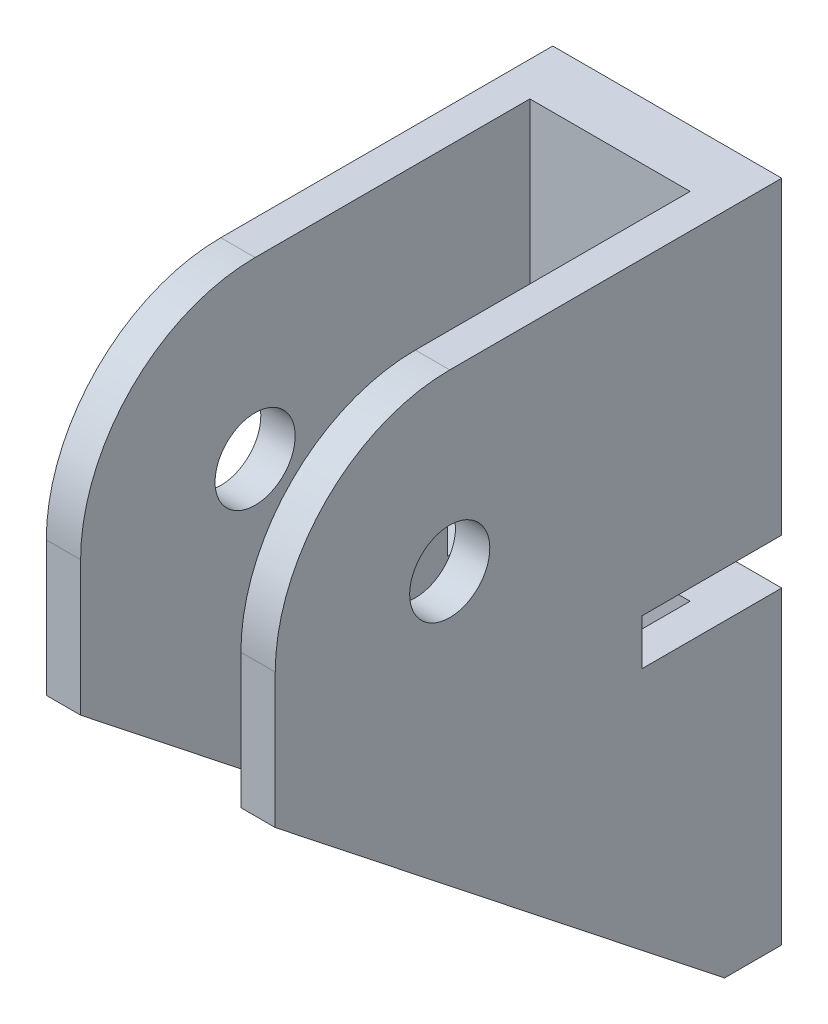
ISO-10303-21;
HEADER;
FILE_DESCRIPTION(('STEP AP214'),'2;1');
FILE_NAME('part.step','',(''),(''),'','','');
FILE_SCHEMA(('AUTOMOTIVE_DESIGN { 1 0 10303 214 1 1 1 1 }'));
ENDSEC;
DATA;
#1=APPLICATION_CONTEXT('core data for automotive mechanical design processes');
#2=APPLICATION_PROTOCOL_DEFINITION('international standard','automotive_design',2000,#1);
#3=PRODUCT_CONTEXT('',#1,'mechanical');
#4=PRODUCT('Part','Part','',(#3));
#5=PRODUCT_RELATED_PRODUCT_CATEGORY('part','',(#4));
#6=PRODUCT_DEFINITION_FORMATION('','',#4);
#7=PRODUCT_DEFINITION_CONTEXT('part definition',#1,'design');
#8=PRODUCT_DEFINITION('design','',#6,#7);
#9=PRODUCT_DEFINITION_SHAPE('','',#8);
#10=(LENGTH_UNIT() NAMED_UNIT(*) SI_UNIT(.MILLI.,.METRE.));
#11=(NAMED_UNIT(*) PLANE_ANGLE_UNIT() SI_UNIT($,.RADIAN.));
#12=(NAMED_UNIT(*) SI_UNIT($,.STERADIAN.) SOLID_ANGLE_UNIT());
#13=UNCERTAINTY_MEASURE_WITH_UNIT(LENGTH_MEASURE(1.E-05),#10,'distance_accuracy_value','');
#14=(GEOMETRIC_REPRESENTATION_CONTEXT(3) GLOBAL_UNCERTAINTY_ASSIGNED_CONTEXT((#13)) GLOBAL_UNIT_ASSIGNED_CONTEXT((#10,
#11,#12)) REPRESENTATION_CONTEXT('',''));
#15=CARTESIAN_POINT('',(0.,0.,0.));
#16=DIRECTION('',(0.,0.,1.));
#17=DIRECTION('',(1.,0.,0.));
#18=AXIS2_PLACEMENT_3D('',#15,#16,#17);
#19=CARTESIAN_POINT('',(0.,0.,2.5));
#20=DIRECTION('',(0.,0.,1.));
#21=DIRECTION('',(1.,0.,0.));
#22=AXIS2_PLACEMENT_3D('',#19,#20,#21);
#23=PLANE('',#22);
#24=CARTESIAN_POINT('',(8.63063628005088,59.9219213633693,2.5));
#25=DIRECTION('',(0.,0.,1.));
#26=DIRECTION('',(1.,0.,0.));
#27=AXIS2_PLACEMENT_3D('',#24,#25,#26);
#28=CIRCLE('',#27,1.75);
#29=CARTESIAN_POINT('',(10.3806362800509,59.9219213633693,2.5));
#30=VERTEX_POINT('',#29);
#31=EDGE_CURVE('E311',#30,#30,#28,.T.);
#32=ORIENTED_EDGE('',*,*,#31,.F.);
#33=EDGE_LOOP('',(#32));
#34=FACE_BOUND('',#33,.T.);
#35=DIRECTION('',(1.,0.,0.));
#36=VECTOR('',#35,1.);
#37=CARTESIAN_POINT('',(0.,52.4219213633683,2.5));
#38=LINE('',#37,#36);
#39=CARTESIAN_POINT('',(5.13063628005088,52.4219213633683,2.5));
#40=VERTEX_POINT('',#39);
#41=CARTESIAN_POINT('',(12.1306362800509,52.4219213633683,2.5));
#42=VERTEX_POINT('',#41);
#43=EDGE_CURVE('E317',#40,#42,#38,.T.);
#44=ORIENTED_EDGE('',*,*,#43,.T.);
#45=DIRECTION('',(0.,1.,0.));
#46=VECTOR('',#45,1.);
#47=CARTESIAN_POINT('',(12.1306362800509,0.,2.5));
#48=LINE('',#47,#46);
#49=CARTESIAN_POINT('',(12.1306362800509,65.9219213633693,2.5));
#50=VERTEX_POINT('',#49);
#51=EDGE_CURVE('E51',#42,#50,#48,.T.);
#52=ORIENTED_EDGE('',*,*,#51,.T.);
#53=DIRECTION('',(1.,0.,0.));
#54=VECTOR('',#53,1.);
#55=CARTESIAN_POINT('',(0.,65.9219213633693,2.5));
#56=LINE('',#55,#54);
#57=CARTESIAN_POINT('',(5.13063628005088,65.9219213633693,2.5));
#58=VERTEX_POINT('',#57);
#59=EDGE_CURVE('E314',#58,#50,#56,.T.);
#60=ORIENTED_EDGE('',*,*,#59,.F.);
#61=DIRECTION('',(0.,1.,0.));
#62=VECTOR('',#61,1.);
#63=CARTESIAN_POINT('',(5.13063628005088,0.,2.5));
#64=LINE('',#63,#62);
#65=EDGE_CURVE('E274',#40,#58,#64,.T.);
#66=ORIENTED_EDGE('',*,*,#65,.F.);
#67=EDGE_LOOP('',(#44,#52,#60,#66));
#68=FACE_BOUND('',#67,.T.);
#69=ADVANCED_FACE('F35',(#34,#68),#23,.T.);
#70=CARTESIAN_POINT('',(0.,0.,2.5));
#71=DIRECTION('',(0.,0.,1.));
#72=DIRECTION('',(1.,0.,0.));
#73=AXIS2_PLACEMENT_3D('',#70,#71,#72);
#74=PLANE('',#73);
#75=CARTESIAN_POINT('',(8.63063628005088,74.4219213633691,2.5));
#76=DIRECTION('',(0.,0.,1.));
#77=DIRECTION('',(1.,0.,0.));
#78=AXIS2_PLACEMENT_3D('',#75,#76,#77);
#79=CIRCLE('',#78,1.75);
#80=CARTESIAN_POINT('',(10.3806362800509,74.4219213633691,2.5));
#81=VERTEX_POINT('',#80);
#82=EDGE_CURVE('E237',#81,#81,#79,.T.);
#83=ORIENTED_EDGE('',*,*,#82,.F.);
#84=EDGE_LOOP('',(#83));
#85=FACE_BOUND('',#84,.T.);
#86=DIRECTION('',(1.,0.,0.));
#87=VECTOR('',#86,1.);
#88=CARTESIAN_POINT('',(0.,67.9219213633687,2.5));
#89=LINE('',#88,#87);
#90=CARTESIAN_POINT('',(5.13063628005088,67.9219213633687,2.5));
#91=VERTEX_POINT('',#90);
#92=CARTESIAN_POINT('',(12.1306362800509,67.9219213633687,2.5));
#93=VERTEX_POINT('',#92);
#94=EDGE_CURVE('E233',#91,#93,#89,.T.);
#95=ORIENTED_EDGE('',*,*,#94,.T.);
#96=DIRECTION('',(0.,1.,0.));
#97=VECTOR('',#96,1.);
#98=CARTESIAN_POINT('',(12.1306362800509,0.,2.5));
#99=LINE('',#98,#97);
#100=CARTESIAN_POINT('',(12.1306362800509,81.421921363369,2.5));
#101=VERTEX_POINT('',#100);
#102=EDGE_CURVE('E211',#93,#101,#99,.T.);
#103=ORIENTED_EDGE('',*,*,#102,.T.);
#104=DIRECTION('',(1.,0.,0.));
#105=VECTOR('',#104,1.);
#106=CARTESIAN_POINT('',(0.,81.421921363369,2.5));
#107=LINE('',#106,#105);
#108=CARTESIAN_POINT('',(5.13063628005088,81.421921363369,2.5));
#109=VERTEX_POINT('',#108);
#110=EDGE_CURVE('E230',#109,#101,#107,.T.);
#111=ORIENTED_EDGE('',*,*,#110,.F.);
#112=DIRECTION('',(0.,1.,0.));
#113=VECTOR('',#112,1.);
#114=CARTESIAN_POINT('',(5.13063628005088,0.,2.5));
#115=LINE('',#114,#113);
#116=EDGE_CURVE('E264',#91,#109,#115,.T.);
#117=ORIENTED_EDGE('',*,*,#116,.F.);
#118=EDGE_LOOP('',(#95,#103,#111,#117));
#119=FACE_BOUND('',#118,.T.);
#120=ADVANCED_FACE('F398',(#85,#119),#74,.T.);
#121=CARTESIAN_POINT('',(13.6306362800509,0.,2.5));
#122=DIRECTION('',(1.,0.,0.));
#123=DIRECTION('',(0.,0.,-1.));
#124=AXIS2_PLACEMENT_3D('',#121,#122,#123);
#125=PLANE('',#124);
#126=CARTESIAN_POINT('',(13.6306362800509,73.801921363369,14.5));
#127=DIRECTION('',(1.,0.,0.));
#128=DIRECTION('',(0.,0.,-1.));
#129=AXIS2_PLACEMENT_3D('',#126,#127,#128);
#130=CIRCLE('',#129,1.7499965);
#131=CARTESIAN_POINT('',(13.6306362800509,72.051924863369,14.5));
#132=VERTEX_POINT('',#131);
#133=EDGE_CURVE('E198',#132,#132,#130,.T.);
#134=ORIENTED_EDGE('',*,*,#133,.F.);
#135=EDGE_LOOP('',(#134));
#136=FACE_BOUND('',#135,.T.);
#137=DIRECTION('',(0.,-1.,0.));
#138=VECTOR('',#137,1.);
#139=CARTESIAN_POINT('',(13.6306362800509,0.,0.));
#140=LINE('',#139,#138);
#141=CARTESIAN_POINT('',(13.6306362800509,65.9219213633693,0.));
#142=VERTEX_POINT('',#141);
#143=CARTESIAN_POINT('',(13.6306362800509,52.4219213633683,0.));
#144=VERTEX_POINT('',#143);
#145=EDGE_CURVE('E324',#142,#144,#140,.T.);
#146=ORIENTED_EDGE('',*,*,#145,.F.);
#147=DIRECTION('',(0.,0.,-1.));
#148=VECTOR('',#147,1.);
#149=CARTESIAN_POINT('',(13.6306362800509,65.9219213633693,2.5));
#150=LINE('',#149,#148);
#151=CARTESIAN_POINT('',(13.6306362800509,65.9219213633693,6.10015991446744));
#152=VERTEX_POINT('',#151);
#153=EDGE_CURVE('E11',#152,#142,#150,.T.);
#154=ORIENTED_EDGE('',*,*,#153,.F.);
#155=DIRECTION('',(0.,1.,0.));
#156=VECTOR('',#155,1.);
#157=CARTESIAN_POINT('',(13.6306362800509,0.,6.10015991446744));
#158=LINE('',#157,#156);
#159=CARTESIAN_POINT('',(13.6306362800509,67.9219213633687,6.10015991446744));
#160=VERTEX_POINT('',#159);
#161=EDGE_CURVE('E192',#152,#160,#158,.T.);
#162=ORIENTED_EDGE('',*,*,#161,.T.);
#163=DIRECTION('',(0.,0.,-1.));
#164=VECTOR('',#163,1.);
#165=CARTESIAN_POINT('',(13.6306362800509,67.9219213633687,2.5));
#166=LINE('',#165,#164);
#167=CARTESIAN_POINT('',(13.6306362800509,67.9219213633687,0.));
#168=VERTEX_POINT('',#167);
#169=EDGE_CURVE('E240',#160,#168,#166,.T.);
#170=ORIENTED_EDGE('',*,*,#169,.T.);
#171=DIRECTION('',(0.,-1.,0.));
#172=VECTOR('',#171,1.);
#173=CARTESIAN_POINT('',(13.6306362800508,0.,0.));
#174=LINE('',#173,#172);
#175=CARTESIAN_POINT('',(13.6306362800509,81.421921363369,0.));
#176=VERTEX_POINT('',#175);
#177=EDGE_CURVE('E221',#176,#168,#174,.T.);
#178=ORIENTED_EDGE('',*,*,#177,.F.);
#179=DIRECTION('',(0.,0.,-1.));
#180=VECTOR('',#179,1.);
#181=CARTESIAN_POINT('',(13.6306362800509,81.421921363369,2.5));
#182=LINE('',#181,#180);
#183=CARTESIAN_POINT('',(13.6306362800509,81.421921363369,14.5));
#184=VERTEX_POINT('',#183);
#185=EDGE_CURVE('E255',#184,#176,#182,.T.);
#186=ORIENTED_EDGE('',*,*,#185,.F.);
#187=CARTESIAN_POINT('',(13.6306362800509,73.801921363369,14.5));
#188=DIRECTION('',(-1.,0.,0.));
#189=DIRECTION('',(0.,0.,1.));
#190=AXIS2_PLACEMENT_3D('',#187,#188,#189);
#191=CIRCLE('',#190,7.62);
#192=CARTESIAN_POINT('',(13.6306362800509,73.801921363369,22.12));
#193=VERTEX_POINT('',#192);
#194=EDGE_CURVE('E215',#184,#193,#191,.F.);
#195=ORIENTED_EDGE('',*,*,#194,.T.);
#196=DIRECTION('',(0.,-1.,0.));
#197=VECTOR('',#196,1.);
#198=CARTESIAN_POINT('',(13.6306362800509,0.,22.12));
#199=LINE('',#198,#197);
#200=CARTESIAN_POINT('',(13.6306362800509,67.9219213633687,22.12));
#201=VERTEX_POINT('',#200);
#202=EDGE_CURVE('E172',#193,#201,#199,.T.);
#203=ORIENTED_EDGE('',*,*,#202,.T.);
#204=DIRECTION('',(0.,0.619903600087596,0.784677976368929));
#205=VECTOR('',#204,1.);
#206=CARTESIAN_POINT('',(13.6306362800509,31.0611388490823,-24.5386163180828));
#207=LINE('',#206,#205);
#208=CARTESIAN_POINT('',(13.6306362800509,52.4219213633684,2.5));
#209=VERTEX_POINT('',#208);
#210=EDGE_CURVE('E195',#209,#201,#207,.T.);
#211=ORIENTED_EDGE('',*,*,#210,.F.);
#212=DIRECTION('',(0.,0.,-1.));
#213=VECTOR('',#212,1.);
#214=CARTESIAN_POINT('',(13.6306362800509,52.4219213633683,2.5));
#215=LINE('',#214,#213);
#216=EDGE_CURVE('E321',#209,#144,#215,.T.);
#217=ORIENTED_EDGE('',*,*,#216,.T.);
#218=EDGE_LOOP('',(#146,#154,#162,#170,#178,#186,#195,#203,#211,#217));
#219=FACE_BOUND('',#218,.T.);
#220=ADVANCED_FACE('F352',(#136,#219),#125,.T.);
#221=CARTESIAN_POINT('',(0.,65.9219213633693,2.5));
#222=DIRECTION('',(0.,1.,0.));
#223=DIRECTION('',(0.,0.,1.));
#224=AXIS2_PLACEMENT_3D('',#221,#222,#223);
#225=PLANE('',#224);
#226=DIRECTION('',(1.,0.,0.));
#227=VECTOR('',#226,1.);
#228=CARTESIAN_POINT('',(0.,65.9219213633693,0.));
#229=LINE('',#228,#227);
#230=CARTESIAN_POINT('',(3.63063628005088,65.9219213633693,0.));
#231=VERTEX_POINT('',#230);
#232=EDGE_CURVE('E327',#231,#142,#229,.T.);
#233=ORIENTED_EDGE('',*,*,#232,.F.);
#234=DIRECTION('',(0.,0.,-1.));
#235=VECTOR('',#234,1.);
#236=CARTESIAN_POINT('',(3.63063628005088,65.9219213633693,2.5));
#237=LINE('',#236,#235);
#238=CARTESIAN_POINT('',(3.63063628005088,65.9219213633693,6.10015991446744));
#239=VERTEX_POINT('',#238);
#240=EDGE_CURVE('E44',#239,#231,#237,.T.);
#241=ORIENTED_EDGE('',*,*,#240,.F.);
#242=DIRECTION('',(-1.,0.,0.));
#243=VECTOR('',#242,1.);
#244=CARTESIAN_POINT('',(5.13063628005088,65.9219213633693,6.10015991446744));
#245=LINE('',#244,#243);
#246=CARTESIAN_POINT('',(5.13063628005088,65.9219213633693,6.10015991446744));
#247=VERTEX_POINT('',#246);
#248=EDGE_CURVE('E304',#247,#239,#245,.T.);
#249=ORIENTED_EDGE('',*,*,#248,.F.);
#250=DIRECTION('',(0.,0.,1.));
#251=VECTOR('',#250,1.);
#252=CARTESIAN_POINT('',(5.13063628005088,65.9219213633693,0.));
#253=LINE('',#252,#251);
#254=EDGE_CURVE('E272',#58,#247,#253,.T.);
#255=ORIENTED_EDGE('',*,*,#254,.F.);
#256=ORIENTED_EDGE('',*,*,#59,.T.);
#257=DIRECTION('',(0.,0.,1.));
#258=VECTOR('',#257,1.);
#259=CARTESIAN_POINT('',(12.1306362800509,65.9219213633693,0.));
#260=LINE('',#259,#258);
#261=CARTESIAN_POINT('',(12.1306362800509,65.9219213633693,6.10015991446744));
#262=VERTEX_POINT('',#261);
#263=EDGE_CURVE('E203',#50,#262,#260,.T.);
#264=ORIENTED_EDGE('',*,*,#263,.T.);
#265=DIRECTION('',(1.,0.,0.));
#266=VECTOR('',#265,1.);
#267=CARTESIAN_POINT('',(12.1306362800509,65.9219213633693,6.10015991446744));
#268=LINE('',#267,#266);
#269=EDGE_CURVE('E225',#262,#152,#268,.T.);
#270=ORIENTED_EDGE('',*,*,#269,.T.);
#271=ORIENTED_EDGE('',*,*,#153,.T.);
#272=EDGE_LOOP('',(#233,#241,#249,#255,#256,#264,#270,#271));
#273=FACE_BOUND('',#272,.T.);
#274=ADVANCED_FACE('F348',(#273),#225,.T.);
#275=CARTESIAN_POINT('',(3.63063628005091,0.,2.5));
#276=DIRECTION('',(1.,0.,0.));
#277=DIRECTION('',(0.,1.,0.));
#278=AXIS2_PLACEMENT_3D('',#275,#276,#277);
#279=PLANE('',#278);
#280=CARTESIAN_POINT('',(3.63063628005087,73.801921363369,14.5));
#281=DIRECTION('',(-1.,0.,0.));
#282=DIRECTION('',(0.,-1.,0.));
#283=AXIS2_PLACEMENT_3D('',#280,#281,#282);
#284=CIRCLE('',#283,1.7499965);
#285=CARTESIAN_POINT('',(3.63063628005088,72.051924863369,14.5));
#286=VERTEX_POINT('',#285);
#287=EDGE_CURVE('E649',#286,#286,#284,.T.);
#288=ORIENTED_EDGE('',*,*,#287,.F.);
#289=EDGE_LOOP('',(#288));
#290=FACE_BOUND('',#289,.T.);
#291=DIRECTION('',(0.,-1.,0.));
#292=VECTOR('',#291,1.);
#293=CARTESIAN_POINT('',(3.63063628005091,0.,0.));
#294=LINE('',#293,#292);
#295=CARTESIAN_POINT('',(3.63063628005088,52.4219213633683,0.));
#296=VERTEX_POINT('',#295);
#297=EDGE_CURVE('E330',#231,#296,#294,.T.);
#298=ORIENTED_EDGE('',*,*,#297,.T.);
#299=DIRECTION('',(0.,0.,-1.));
#300=VECTOR('',#299,1.);
#301=CARTESIAN_POINT('',(3.63063628005088,52.4219213633683,2.5));
#302=LINE('',#301,#300);
#303=CARTESIAN_POINT('',(3.63063628005088,52.4219213633684,2.5));
#304=VERTEX_POINT('',#303);
#305=EDGE_CURVE('E336',#304,#296,#302,.T.);
#306=ORIENTED_EDGE('',*,*,#305,.F.);
#307=DIRECTION('',(0.,0.619903600087596,0.784677976368929));
#308=VECTOR('',#307,1.);
#309=CARTESIAN_POINT('',(3.63063628005088,31.0611388490823,-24.5386163180828));
#310=LINE('',#309,#308);
#311=CARTESIAN_POINT('',(3.63063628005088,67.9219213633687,22.12));
#312=VERTEX_POINT('',#311);
#313=EDGE_CURVE('E293',#304,#312,#310,.T.);
#314=ORIENTED_EDGE('',*,*,#313,.T.);
#315=DIRECTION('',(0.,-1.,0.));
#316=VECTOR('',#315,1.);
#317=CARTESIAN_POINT('',(3.63063628005088,0.,22.12));
#318=LINE('',#317,#316);
#319=CARTESIAN_POINT('',(3.63063628005088,73.801921363369,22.12));
#320=VERTEX_POINT('',#319);
#321=EDGE_CURVE('E262',#320,#312,#318,.T.);
#322=ORIENTED_EDGE('',*,*,#321,.F.);
#323=CARTESIAN_POINT('',(3.63063628005088,73.801921363369,14.5));
#324=DIRECTION('',(-1.,0.,0.));
#325=DIRECTION('',(0.,0.,1.));
#326=AXIS2_PLACEMENT_3D('',#323,#324,#325);
#327=CIRCLE('',#326,7.62);
#328=CARTESIAN_POINT('',(3.63063628005088,81.421921363369,14.5));
#329=VERTEX_POINT('',#328);
#330=EDGE_CURVE('E257',#329,#320,#327,.F.);
#331=ORIENTED_EDGE('',*,*,#330,.F.);
#332=DIRECTION('',(0.,0.,1.));
#333=VECTOR('',#332,1.);
#334=CARTESIAN_POINT('',(3.63063628005088,81.421921363369,0.));
#335=LINE('',#334,#333);
#336=CARTESIAN_POINT('',(3.63063628005088,81.421921363369,0.));
#337=VERTEX_POINT('',#336);
#338=EDGE_CURVE('E285',#337,#329,#335,.T.);
#339=ORIENTED_EDGE('',*,*,#338,.F.);
#340=DIRECTION('',(0.,-1.,0.));
#341=VECTOR('',#340,1.);
#342=CARTESIAN_POINT('',(3.63063628005088,0.,0.));
#343=LINE('',#342,#341);
#344=CARTESIAN_POINT('',(3.63063628005088,67.9219213633687,0.));
#345=VERTEX_POINT('',#344);
#346=EDGE_CURVE('E246',#337,#345,#343,.T.);
#347=ORIENTED_EDGE('',*,*,#346,.T.);
#348=DIRECTION('',(0.,0.,1.));
#349=VECTOR('',#348,1.);
#350=CARTESIAN_POINT('',(3.63063628005088,67.9219213633687,0.));
#351=LINE('',#350,#349);
#352=CARTESIAN_POINT('',(3.63063628005088,67.9219213633687,6.10015991446744));
#353=VERTEX_POINT('',#352);
#354=EDGE_CURVE('E287',#345,#353,#351,.T.);
#355=ORIENTED_EDGE('',*,*,#354,.T.);
#356=DIRECTION('',(0.,1.,0.));
#357=VECTOR('',#356,1.);
#358=CARTESIAN_POINT('',(3.63063628005088,0.,6.10015991446744));
#359=LINE('',#358,#357);
#360=EDGE_CURVE('E290',#239,#353,#359,.T.);
#361=ORIENTED_EDGE('',*,*,#360,.F.);
#362=ORIENTED_EDGE('',*,*,#240,.T.);
#363=EDGE_LOOP('',(#298,#306,#314,#322,#331,#339,#347,#355,#361,#362));
#364=FACE_BOUND('',#363,.T.);
#365=ADVANCED_FACE('F342',(#290,#364),#279,.F.);
#366=CARTESIAN_POINT('',(8.63063628005088,59.9219213633693,2.5));
#367=DIRECTION('',(0.,0.,-1.));
#368=DIRECTION('',(-1.,0.,0.));
#369=AXIS2_PLACEMENT_3D('',#366,#367,#368);
#370=CYLINDRICAL_SURFACE('',#369,1.75);
#371=ORIENTED_EDGE('',*,*,#31,.T.);
#372=EDGE_LOOP('',(#371));
#373=FACE_BOUND('',#372,.T.);
#374=CARTESIAN_POINT('',(8.63063628005088,59.9219213633693,0.));
#375=DIRECTION('',(0.,0.,1.));
#376=DIRECTION('',(1.,0.,0.));
#377=AXIS2_PLACEMENT_3D('',#374,#375,#376);
#378=CIRCLE('',#377,1.75);
#379=CARTESIAN_POINT('',(10.3806362800509,59.9219213633693,0.));
#380=VERTEX_POINT('',#379);
#381=EDGE_CURVE('E301',#380,#380,#378,.T.);
#382=ORIENTED_EDGE('',*,*,#381,.F.);
#383=EDGE_LOOP('',(#382));
#384=FACE_BOUND('',#383,.T.);
#385=ADVANCED_FACE('F37',(#373,#384),#370,.F.);
#386=CARTESIAN_POINT('',(0.,52.4219213633683,2.5));
#387=DIRECTION('',(0.,1.,0.));
#388=DIRECTION('',(0.,0.,1.));
#389=AXIS2_PLACEMENT_3D('',#386,#387,#388);
#390=PLANE('',#389);
#391=DIRECTION('',(1.,0.,0.));
#392=VECTOR('',#391,1.);
#393=CARTESIAN_POINT('',(0.,52.4219213633683,0.));
#394=LINE('',#393,#392);
#395=EDGE_CURVE('E315',#296,#144,#394,.T.);
#396=ORIENTED_EDGE('',*,*,#395,.T.);
#397=ORIENTED_EDGE('',*,*,#216,.F.);
#398=DIRECTION('',(1.,0.,0.));
#399=VECTOR('',#398,1.);
#400=CARTESIAN_POINT('',(12.1306362800509,52.4219213633684,2.5));
#401=LINE('',#400,#399);
#402=EDGE_CURVE('E59',#42,#209,#401,.T.);
#403=ORIENTED_EDGE('',*,*,#402,.F.);
#404=ORIENTED_EDGE('',*,*,#43,.F.);
#405=EDGE_CURVE('E318',#304,#40,#38,.T.);
#406=ORIENTED_EDGE('',*,*,#405,.F.);
#407=ORIENTED_EDGE('',*,*,#305,.T.);
#408=EDGE_LOOP('',(#396,#397,#403,#404,#406,#407));
#409=FACE_BOUND('',#408,.T.);
#410=ADVANCED_FACE('F354',(#409),#390,.F.);
#411=CARTESIAN_POINT('',(0.,0.,0.));
#412=DIRECTION('',(0.,0.,1.));
#413=DIRECTION('',(1.,0.,0.));
#414=AXIS2_PLACEMENT_3D('',#411,#412,#413);
#415=PLANE('',#414);
#416=ORIENTED_EDGE('',*,*,#381,.T.);
#417=EDGE_LOOP('',(#416));
#418=FACE_BOUND('',#417,.T.);
#419=ORIENTED_EDGE('',*,*,#145,.T.);
#420=ORIENTED_EDGE('',*,*,#395,.F.);
#421=ORIENTED_EDGE('',*,*,#297,.F.);
#422=ORIENTED_EDGE('',*,*,#232,.T.);
#423=EDGE_LOOP('',(#419,#420,#421,#422));
#424=FACE_BOUND('',#423,.T.);
#425=ADVANCED_FACE('F347',(#418,#424),#415,.F.);
#426=CARTESIAN_POINT('',(5.13063628005088,73.801921363369,14.5));
#427=DIRECTION('',(-1.,0.,0.));
#428=DIRECTION('',(0.,0.,1.));
#429=AXIS2_PLACEMENT_3D('',#426,#427,#428);
#430=CYLINDRICAL_SURFACE('',#429,7.62);
#431=ORIENTED_EDGE('',*,*,#330,.T.);
#432=DIRECTION('',(-1.,0.,0.));
#433=VECTOR('',#432,1.);
#434=CARTESIAN_POINT('',(5.13063628005088,73.801921363369,22.12));
#435=LINE('',#434,#433);
#436=CARTESIAN_POINT('',(5.13063628005088,73.801921363369,22.12));
#437=VERTEX_POINT('',#436);
#438=EDGE_CURVE('E298',#437,#320,#435,.T.);
#439=ORIENTED_EDGE('',*,*,#438,.F.);
#440=CARTESIAN_POINT('',(5.13063628005088,73.801921363369,14.5));
#441=DIRECTION('',(-1.,0.,0.));
#442=DIRECTION('',(0.,0.,1.));
#443=AXIS2_PLACEMENT_3D('',#440,#441,#442);
#444=CIRCLE('',#443,7.62);
#445=CARTESIAN_POINT('',(5.13063628005088,81.421921363369,14.5));
#446=VERTEX_POINT('',#445);
#447=EDGE_CURVE('E258',#446,#437,#444,.F.);
#448=ORIENTED_EDGE('',*,*,#447,.F.);
#449=DIRECTION('',(-1.,0.,0.));
#450=VECTOR('',#449,1.);
#451=CARTESIAN_POINT('',(5.13063628005088,81.421921363369,14.5));
#452=LINE('',#451,#450);
#453=EDGE_CURVE('E282',#446,#329,#452,.T.);
#454=ORIENTED_EDGE('',*,*,#453,.T.);
#455=EDGE_LOOP('',(#431,#439,#448,#454));
#456=FACE_BOUND('',#455,.T.);
#457=ADVANCED_FACE('F367',(#456),#430,.T.);
#458=CARTESIAN_POINT('',(5.13063628005088,0.,22.12));
#459=DIRECTION('',(0.,0.,-1.));
#460=DIRECTION('',(-1.,0.,0.));
#461=AXIS2_PLACEMENT_3D('',#458,#459,#460);
#462=PLANE('',#461);
#463=ORIENTED_EDGE('',*,*,#321,.T.);
#464=DIRECTION('',(-1.,0.,0.));
#465=VECTOR('',#464,1.);
#466=CARTESIAN_POINT('',(5.13063628005088,67.9219213633687,22.12));
#467=LINE('',#466,#465);
#468=CARTESIAN_POINT('',(5.13063628005088,67.9219213633687,22.12));
#469=VERTEX_POINT('',#468);
#470=EDGE_CURVE('E302',#469,#312,#467,.T.);
#471=ORIENTED_EDGE('',*,*,#470,.F.);
#472=DIRECTION('',(0.,-1.,0.));
#473=VECTOR('',#472,1.);
#474=CARTESIAN_POINT('',(5.13063628005088,0.,22.12));
#475=LINE('',#474,#473);
#476=EDGE_CURVE('E280',#437,#469,#475,.T.);
#477=ORIENTED_EDGE('',*,*,#476,.F.);
#478=ORIENTED_EDGE('',*,*,#438,.T.);
#479=EDGE_LOOP('',(#463,#471,#477,#478));
#480=FACE_BOUND('',#479,.T.);
#481=ADVANCED_FACE('F363',(#480),#462,.F.);
#482=CARTESIAN_POINT('',(5.13063628005088,31.0611388490823,-24.5386163180828));
#483=DIRECTION('',(0.,-0.784677976368929,0.619903600087596));
#484=DIRECTION('',(0.,-0.619903600087596,-0.784677976368929));
#485=AXIS2_PLACEMENT_3D('',#482,#483,#484);
#486=PLANE('',#485);
#487=ORIENTED_EDGE('',*,*,#313,.F.);
#488=ORIENTED_EDGE('',*,*,#405,.T.);
#489=DIRECTION('',(0.,0.619903600087596,0.784677976368929));
#490=VECTOR('',#489,1.);
#491=CARTESIAN_POINT('',(5.13063628005088,31.0611388490823,-24.5386163180828));
#492=LINE('',#491,#490);
#493=EDGE_CURVE('E277',#40,#469,#492,.T.);
#494=ORIENTED_EDGE('',*,*,#493,.T.);
#495=ORIENTED_EDGE('',*,*,#470,.T.);
#496=EDGE_LOOP('',(#487,#488,#494,#495));
#497=FACE_BOUND('',#496,.T.);
#498=ADVANCED_FACE('F359',(#497),#486,.T.);
#499=CARTESIAN_POINT('',(5.13063628005088,0.,6.10015991446744));
#500=DIRECTION('',(0.,0.,1.));
#501=DIRECTION('',(1.,0.,0.));
#502=AXIS2_PLACEMENT_3D('',#499,#500,#501);
#503=PLANE('',#502);
#504=ORIENTED_EDGE('',*,*,#360,.T.);
#505=DIRECTION('',(-1.,0.,0.));
#506=VECTOR('',#505,1.);
#507=CARTESIAN_POINT('',(5.13063628005088,67.9219213633687,6.10015991446744));
#508=LINE('',#507,#506);
#509=CARTESIAN_POINT('',(5.13063628005088,67.9219213633687,6.10015991446744));
#510=VERTEX_POINT('',#509);
#511=EDGE_CURVE('E307',#510,#353,#508,.T.);
#512=ORIENTED_EDGE('',*,*,#511,.F.);
#513=DIRECTION('',(0.,1.,0.));
#514=VECTOR('',#513,1.);
#515=CARTESIAN_POINT('',(5.13063628005088,0.,6.10015991446744));
#516=LINE('',#515,#514);
#517=EDGE_CURVE('E270',#247,#510,#516,.T.);
#518=ORIENTED_EDGE('',*,*,#517,.F.);
#519=ORIENTED_EDGE('',*,*,#248,.T.);
#520=EDGE_LOOP('',(#504,#512,#518,#519));
#521=FACE_BOUND('',#520,.T.);
#522=ADVANCED_FACE('F386',(#521),#503,.F.);
#523=CARTESIAN_POINT('',(5.13063628005088,67.9219213633687,0.));
#524=DIRECTION('',(0.,-1.,0.));
#525=DIRECTION('',(0.,0.,-1.));
#526=AXIS2_PLACEMENT_3D('',#523,#524,#525);
#527=PLANE('',#526);
#528=ORIENTED_EDGE('',*,*,#354,.F.);
#529=DIRECTION('',(1.,0.,0.));
#530=VECTOR('',#529,1.);
#531=CARTESIAN_POINT('',(0.,67.9219213633687,0.));
#532=LINE('',#531,#530);
#533=EDGE_CURVE('E249',#345,#168,#532,.T.);
#534=ORIENTED_EDGE('',*,*,#533,.T.);
#535=ORIENTED_EDGE('',*,*,#169,.F.);
#536=DIRECTION('',(1.,0.,0.));
#537=VECTOR('',#536,1.);
#538=CARTESIAN_POINT('',(12.1306362800509,67.9219213633687,6.10015991446744));
#539=LINE('',#538,#537);
#540=CARTESIAN_POINT('',(12.1306362800509,67.9219213633687,6.10015991446744));
#541=VERTEX_POINT('',#540);
#542=EDGE_CURVE('E222',#541,#160,#539,.T.);
#543=ORIENTED_EDGE('',*,*,#542,.F.);
#544=DIRECTION('',(0.,0.,1.));
#545=VECTOR('',#544,1.);
#546=CARTESIAN_POINT('',(12.1306362800509,67.9219213633687,0.));
#547=LINE('',#546,#545);
#548=EDGE_CURVE('E209',#93,#541,#547,.T.);
#549=ORIENTED_EDGE('',*,*,#548,.F.);
#550=ORIENTED_EDGE('',*,*,#94,.F.);
#551=DIRECTION('',(0.,0.,1.));
#552=VECTOR('',#551,1.);
#553=CARTESIAN_POINT('',(5.13063628005088,67.9219213633687,0.));
#554=LINE('',#553,#552);
#555=EDGE_CURVE('E267',#91,#510,#554,.T.);
#556=ORIENTED_EDGE('',*,*,#555,.T.);
#557=ORIENTED_EDGE('',*,*,#511,.T.);
#558=EDGE_LOOP('',(#528,#534,#535,#543,#549,#550,#556,#557));
#559=FACE_BOUND('',#558,.T.);
#560=ADVANCED_FACE('F380',(#559),#527,.T.);
#561=CARTESIAN_POINT('',(5.13063628005088,81.421921363369,0.));
#562=DIRECTION('',(0.,-1.,0.));
#563=DIRECTION('',(0.,0.,-1.));
#564=AXIS2_PLACEMENT_3D('',#561,#562,#563);
#565=PLANE('',#564);
#566=ORIENTED_EDGE('',*,*,#338,.T.);
#567=ORIENTED_EDGE('',*,*,#453,.F.);
#568=DIRECTION('',(0.,0.,1.));
#569=VECTOR('',#568,1.);
#570=CARTESIAN_POINT('',(5.13063628005088,81.421921363369,0.));
#571=LINE('',#570,#569);
#572=EDGE_CURVE('E261',#109,#446,#571,.T.);
#573=ORIENTED_EDGE('',*,*,#572,.F.);
#574=ORIENTED_EDGE('',*,*,#110,.T.);
#575=DIRECTION('',(0.,0.,1.));
#576=VECTOR('',#575,1.);
#577=CARTESIAN_POINT('',(12.1306362800509,81.421921363369,0.));
#578=LINE('',#577,#576);
#579=CARTESIAN_POINT('',(12.1306362800509,81.421921363369,14.5));
#580=VERTEX_POINT('',#579);
#581=EDGE_CURVE('E178',#101,#580,#578,.T.);
#582=ORIENTED_EDGE('',*,*,#581,.T.);
#583=DIRECTION('',(1.,0.,0.));
#584=VECTOR('',#583,1.);
#585=CARTESIAN_POINT('',(12.1306362800509,81.421921363369,14.5));
#586=LINE('',#585,#584);
#587=EDGE_CURVE('E191',#580,#184,#586,.T.);
#588=ORIENTED_EDGE('',*,*,#587,.T.);
#589=ORIENTED_EDGE('',*,*,#185,.T.);
#590=DIRECTION('',(1.,0.,0.));
#591=VECTOR('',#590,1.);
#592=CARTESIAN_POINT('',(0.,81.421921363369,0.));
#593=LINE('',#592,#591);
#594=EDGE_CURVE('E243',#337,#176,#593,.T.);
#595=ORIENTED_EDGE('',*,*,#594,.F.);
#596=EDGE_LOOP('',(#566,#567,#573,#574,#582,#588,#589,#595));
#597=FACE_BOUND('',#596,.T.);
#598=ADVANCED_FACE('F376',(#597),#565,.F.);
#599=CARTESIAN_POINT('',(5.13063628005088,0.,0.));
#600=DIRECTION('',(-1.,0.,0.));
#601=DIRECTION('',(0.,0.,1.));
#602=AXIS2_PLACEMENT_3D('',#599,#600,#601);
#603=PLANE('',#602);
#604=CARTESIAN_POINT('',(5.13063628005088,73.801921363369,14.5));
#605=DIRECTION('',(-1.,0.,0.));
#606=DIRECTION('',(0.,0.,1.));
#607=AXIS2_PLACEMENT_3D('',#604,#605,#606);
#608=CIRCLE('',#607,1.7499965);
#609=CARTESIAN_POINT('',(5.13063628005088,72.051924863369,14.5));
#610=VERTEX_POINT('',#609);
#611=EDGE_CURVE('E652',#610,#610,#608,.T.);
#612=ORIENTED_EDGE('',*,*,#611,.T.);
#613=EDGE_LOOP('',(#612));
#614=FACE_BOUND('',#613,.T.);
#615=ORIENTED_EDGE('',*,*,#447,.T.);
#616=ORIENTED_EDGE('',*,*,#476,.T.);
#617=ORIENTED_EDGE('',*,*,#493,.F.);
#618=ORIENTED_EDGE('',*,*,#65,.T.);
#619=ORIENTED_EDGE('',*,*,#254,.T.);
#620=ORIENTED_EDGE('',*,*,#517,.T.);
#621=ORIENTED_EDGE('',*,*,#555,.F.);
#622=ORIENTED_EDGE('',*,*,#116,.T.);
#623=ORIENTED_EDGE('',*,*,#572,.T.);
#624=EDGE_LOOP('',(#615,#616,#617,#618,#619,#620,#621,#622,#623));
#625=FACE_BOUND('',#624,.T.);
#626=ADVANCED_FACE('F390',(#614,#625),#603,.F.);
#627=CARTESIAN_POINT('',(8.63063628005088,74.4219213633691,2.5));
#628=DIRECTION('',(0.,0.,-1.));
#629=DIRECTION('',(-1.,0.,0.));
#630=AXIS2_PLACEMENT_3D('',#627,#628,#629);
#631=CYLINDRICAL_SURFACE('',#630,1.75);
#632=ORIENTED_EDGE('',*,*,#82,.T.);
#633=EDGE_LOOP('',(#632));
#634=FACE_BOUND('',#633,.T.);
#635=CARTESIAN_POINT('',(8.63063628005088,74.4219213633691,0.));
#636=DIRECTION('',(0.,0.,1.));
#637=DIRECTION('',(1.,0.,0.));
#638=AXIS2_PLACEMENT_3D('',#635,#636,#637);
#639=CIRCLE('',#638,1.75);
#640=CARTESIAN_POINT('',(10.3806362800509,74.4219213633691,0.));
#641=VERTEX_POINT('',#640);
#642=EDGE_CURVE('E234',#641,#641,#639,.T.);
#643=ORIENTED_EDGE('',*,*,#642,.F.);
#644=EDGE_LOOP('',(#643));
#645=FACE_BOUND('',#644,.T.);
#646=ADVANCED_FACE('F416',(#634,#645),#631,.F.);
#647=CARTESIAN_POINT('',(0.,0.,0.));
#648=DIRECTION('',(0.,0.,1.));
#649=DIRECTION('',(1.,0.,0.));
#650=AXIS2_PLACEMENT_3D('',#647,#648,#649);
#651=PLANE('',#650);
#652=ORIENTED_EDGE('',*,*,#177,.T.);
#653=ORIENTED_EDGE('',*,*,#533,.F.);
#654=ORIENTED_EDGE('',*,*,#346,.F.);
#655=ORIENTED_EDGE('',*,*,#594,.T.);
#656=EDGE_LOOP('',(#652,#653,#654,#655));
#657=FACE_BOUND('',#656,.T.);
#658=ORIENTED_EDGE('',*,*,#642,.T.);
#659=EDGE_LOOP('',(#658));
#660=FACE_BOUND('',#659,.T.);
#661=ADVANCED_FACE('F374',(#657,#660),#651,.F.);
#662=CARTESIAN_POINT('',(12.1306362800509,73.801921363369,14.5));
#663=DIRECTION('',(1.,0.,0.));
#664=DIRECTION('',(0.,0.,-1.));
#665=AXIS2_PLACEMENT_3D('',#662,#663,#664);
#666=CYLINDRICAL_SURFACE('',#665,7.62);
#667=ORIENTED_EDGE('',*,*,#194,.F.);
#668=ORIENTED_EDGE('',*,*,#587,.F.);
#669=CARTESIAN_POINT('',(12.1306362800509,73.801921363369,14.5));
#670=DIRECTION('',(-1.,0.,0.));
#671=DIRECTION('',(0.,0.,1.));
#672=AXIS2_PLACEMENT_3D('',#669,#670,#671);
#673=CIRCLE('',#672,7.62);
#674=CARTESIAN_POINT('',(12.1306362800509,73.801921363369,22.12));
#675=VERTEX_POINT('',#674);
#676=EDGE_CURVE('E183',#580,#675,#673,.F.);
#677=ORIENTED_EDGE('',*,*,#676,.T.);
#678=DIRECTION('',(1.,0.,0.));
#679=VECTOR('',#678,1.);
#680=CARTESIAN_POINT('',(12.1306362800509,73.801921363369,22.12));
#681=LINE('',#680,#679);
#682=EDGE_CURVE('E167',#675,#193,#681,.T.);
#683=ORIENTED_EDGE('',*,*,#682,.T.);
#684=EDGE_LOOP('',(#667,#668,#677,#683));
#685=FACE_BOUND('',#684,.T.);
#686=ADVANCED_FACE('F189',(#685),#666,.T.);
#687=CARTESIAN_POINT('',(12.1306362800509,0.,6.10015991446744));
#688=DIRECTION('',(0.,0.,-1.));
#689=DIRECTION('',(-1.,0.,0.));
#690=AXIS2_PLACEMENT_3D('',#687,#688,#689);
#691=PLANE('',#690);
#692=ORIENTED_EDGE('',*,*,#161,.F.);
#693=ORIENTED_EDGE('',*,*,#269,.F.);
#694=DIRECTION('',(0.,1.,0.));
#695=VECTOR('',#694,1.);
#696=CARTESIAN_POINT('',(12.1306362800509,0.,6.10015991446744));
#697=LINE('',#696,#695);
#698=EDGE_CURVE('E206',#262,#541,#697,.T.);
#699=ORIENTED_EDGE('',*,*,#698,.T.);
#700=ORIENTED_EDGE('',*,*,#542,.T.);
#701=EDGE_LOOP('',(#692,#693,#699,#700));
#702=FACE_BOUND('',#701,.T.);
#703=ADVANCED_FACE('F396',(#702),#691,.T.);
#704=CARTESIAN_POINT('',(12.1306362800509,31.0611388490823,-24.5386163180828));
#705=DIRECTION('',(0.,0.784677976368929,-0.619903600087596));
#706=DIRECTION('',(0.,0.619903600087596,0.784677976368929));
#707=AXIS2_PLACEMENT_3D('',#704,#705,#706);
#708=PLANE('',#707);
#709=ORIENTED_EDGE('',*,*,#210,.T.);
#710=DIRECTION('',(1.,0.,0.));
#711=VECTOR('',#710,1.);
#712=CARTESIAN_POINT('',(12.1306362800509,67.9219213633687,22.12));
#713=LINE('',#712,#711);
#714=CARTESIAN_POINT('',(12.1306362800509,67.9219213633687,22.12));
#715=VERTEX_POINT('',#714);
#716=EDGE_CURVE('E177',#715,#201,#713,.T.);
#717=ORIENTED_EDGE('',*,*,#716,.F.);
#718=DIRECTION('',(0.,0.619903600087596,0.784677976368929));
#719=VECTOR('',#718,1.);
#720=CARTESIAN_POINT('',(12.1306362800509,31.0611388490823,-24.5386163180828));
#721=LINE('',#720,#719);
#722=EDGE_CURVE('E186',#42,#715,#721,.T.);
#723=ORIENTED_EDGE('',*,*,#722,.F.);
#724=ORIENTED_EDGE('',*,*,#402,.T.);
#725=EDGE_LOOP('',(#709,#717,#723,#724));
#726=FACE_BOUND('',#725,.T.);
#727=ADVANCED_FACE('F392',(#726),#708,.F.);
#728=CARTESIAN_POINT('',(12.1306362800509,0.,22.12));
#729=DIRECTION('',(0.,0.,1.));
#730=DIRECTION('',(1.,0.,0.));
#731=AXIS2_PLACEMENT_3D('',#728,#729,#730);
#732=PLANE('',#731);
#733=ORIENTED_EDGE('',*,*,#202,.F.);
#734=ORIENTED_EDGE('',*,*,#682,.F.);
#735=DIRECTION('',(0.,-1.,0.));
#736=VECTOR('',#735,1.);
#737=CARTESIAN_POINT('',(12.1306362800509,0.,22.12));
#738=LINE('',#737,#736);
#739=EDGE_CURVE('E170',#675,#715,#738,.T.);
#740=ORIENTED_EDGE('',*,*,#739,.T.);
#741=ORIENTED_EDGE('',*,*,#716,.T.);
#742=EDGE_LOOP('',(#733,#734,#740,#741));
#743=FACE_BOUND('',#742,.T.);
#744=ADVANCED_FACE('F169',(#743),#732,.T.);
#745=CARTESIAN_POINT('',(12.1306362800509,0.,0.));
#746=DIRECTION('',(1.,0.,0.));
#747=DIRECTION('',(0.,0.,1.));
#748=AXIS2_PLACEMENT_3D('',#745,#746,#747);
#749=PLANE('',#748);
#750=CARTESIAN_POINT('',(12.1306362800509,73.801921363369,14.5));
#751=DIRECTION('',(1.,0.,0.));
#752=DIRECTION('',(0.,0.,-1.));
#753=AXIS2_PLACEMENT_3D('',#750,#751,#752);
#754=CIRCLE('',#753,1.7499965);
#755=CARTESIAN_POINT('',(12.1306362800509,72.051924863369,14.5));
#756=VERTEX_POINT('',#755);
#757=EDGE_CURVE('E39',#756,#756,#754,.T.);
#758=ORIENTED_EDGE('',*,*,#757,.T.);
#759=EDGE_LOOP('',(#758));
#760=FACE_BOUND('',#759,.T.);
#761=ORIENTED_EDGE('',*,*,#676,.F.);
#762=ORIENTED_EDGE('',*,*,#581,.F.);
#763=ORIENTED_EDGE('',*,*,#102,.F.);
#764=ORIENTED_EDGE('',*,*,#548,.T.);
#765=ORIENTED_EDGE('',*,*,#698,.F.);
#766=ORIENTED_EDGE('',*,*,#263,.F.);
#767=ORIENTED_EDGE('',*,*,#51,.F.);
#768=ORIENTED_EDGE('',*,*,#722,.T.);
#769=ORIENTED_EDGE('',*,*,#739,.F.);
#770=EDGE_LOOP('',(#761,#762,#763,#764,#765,#766,#767,#768,#769));
#771=FACE_BOUND('',#770,.T.);
#772=ADVANCED_FACE('F182',(#760,#771),#749,.F.);
#773=CARTESIAN_POINT('',(16.0766362800509,73.801921363369,14.5));
#774=DIRECTION('',(-1.,0.,0.));
#775=DIRECTION('',(0.,-1.,0.));
#776=AXIS2_PLACEMENT_3D('',#773,#774,#775);
#777=CYLINDRICAL_SURFACE('',#776,1.7499965);
#778=CARTESIAN_POINT('',(13.6306362800509,72.051924863369,14.5));
#779=CARTESIAN_POINT('',(13.6150112800509,72.051924863369,14.5));
#780=CARTESIAN_POINT('',(13.5993862800509,72.051924863369,14.5));
#781=CARTESIAN_POINT('',(13.5681362800509,72.051924863369,14.5));
#782=CARTESIAN_POINT('',(13.5525112800509,72.051924863369,14.5));
#783=CARTESIAN_POINT('',(13.5212612800509,72.051924863369,14.5));
#784=CARTESIAN_POINT('',(13.5056362800509,72.051924863369,14.5));
#785=CARTESIAN_POINT('',(13.4743862800509,72.051924863369,14.5));
#786=CARTESIAN_POINT('',(13.4587612800509,72.051924863369,14.5));
#787=CARTESIAN_POINT('',(13.4275112800509,72.051924863369,14.5));
#788=CARTESIAN_POINT('',(13.4118862800509,72.051924863369,14.5));
#789=CARTESIAN_POINT('',(13.3806362800509,72.051924863369,14.5));
#790=CARTESIAN_POINT('',(13.3650112800509,72.051924863369,14.5));
#791=CARTESIAN_POINT('',(13.3337612800509,72.051924863369,14.5));
#792=CARTESIAN_POINT('',(13.3181362800509,72.051924863369,14.5));
#793=CARTESIAN_POINT('',(13.2868862800509,72.051924863369,14.5));
#794=CARTESIAN_POINT('',(13.2712612800509,72.051924863369,14.5));
#795=CARTESIAN_POINT('',(13.2400112800509,72.051924863369,14.5));
#796=CARTESIAN_POINT('',(13.2243862800509,72.051924863369,14.5));
#797=CARTESIAN_POINT('',(13.1931362800509,72.051924863369,14.5));
#798=CARTESIAN_POINT('',(13.1775112800509,72.051924863369,14.5));
#799=CARTESIAN_POINT('',(13.1462612800509,72.051924863369,14.5));
#800=CARTESIAN_POINT('',(13.1306362800509,72.051924863369,14.5));
#801=CARTESIAN_POINT('',(13.0993862800509,72.051924863369,14.5));
#802=CARTESIAN_POINT('',(13.0837612800509,72.051924863369,14.5));
#803=CARTESIAN_POINT('',(13.0525112800509,72.051924863369,14.5));
#804=CARTESIAN_POINT('',(13.0368862800509,72.051924863369,14.5));
#805=CARTESIAN_POINT('',(13.0056362800509,72.051924863369,14.5));
#806=CARTESIAN_POINT('',(12.9900112800509,72.051924863369,14.5));
#807=CARTESIAN_POINT('',(12.9587612800509,72.051924863369,14.5));
#808=CARTESIAN_POINT('',(12.9431362800509,72.051924863369,14.5));
#809=CARTESIAN_POINT('',(12.9118862800509,72.051924863369,14.5));
#810=CARTESIAN_POINT('',(12.8962612800509,72.051924863369,14.5));
#811=CARTESIAN_POINT('',(12.8650112800509,72.051924863369,14.5));
#812=CARTESIAN_POINT('',(12.8493862800509,72.051924863369,14.5));
#813=CARTESIAN_POINT('',(12.8181362800509,72.051924863369,14.5));
#814=CARTESIAN_POINT('',(12.8025112800509,72.051924863369,14.5));
#815=CARTESIAN_POINT('',(12.7712612800509,72.051924863369,14.5));
#816=CARTESIAN_POINT('',(12.7556362800509,72.051924863369,14.5));
#817=CARTESIAN_POINT('',(12.7243862800509,72.051924863369,14.5));
#818=CARTESIAN_POINT('',(12.7087612800509,72.051924863369,14.5));
#819=CARTESIAN_POINT('',(12.6775112800509,72.051924863369,14.5));
#820=CARTESIAN_POINT('',(12.6618862800509,72.051924863369,14.5));
#821=CARTESIAN_POINT('',(12.6306362800509,72.051924863369,14.5));
#822=CARTESIAN_POINT('',(12.6150112800509,72.051924863369,14.5));
#823=CARTESIAN_POINT('',(12.5837612800509,72.051924863369,14.5));
#824=CARTESIAN_POINT('',(12.5681362800509,72.051924863369,14.5));
#825=CARTESIAN_POINT('',(12.5368862800509,72.051924863369,14.5));
#826=CARTESIAN_POINT('',(12.5212612800509,72.051924863369,14.5));
#827=CARTESIAN_POINT('',(12.4900112800509,72.051924863369,14.5));
#828=CARTESIAN_POINT('',(12.4743862800509,72.051924863369,14.5));
#829=CARTESIAN_POINT('',(12.4431362800509,72.051924863369,14.5));
#830=CARTESIAN_POINT('',(12.4275112800509,72.051924863369,14.5));
#831=CARTESIAN_POINT('',(12.3962612800509,72.051924863369,14.5));
#832=CARTESIAN_POINT('',(12.3806362800509,72.051924863369,14.5));
#833=CARTESIAN_POINT('',(12.3493862800509,72.051924863369,14.5));
#834=CARTESIAN_POINT('',(12.3337612800509,72.051924863369,14.5));
#835=CARTESIAN_POINT('',(12.3025112800509,72.051924863369,14.5));
#836=CARTESIAN_POINT('',(12.2868862800509,72.051924863369,14.5));
#837=CARTESIAN_POINT('',(12.2556362800509,72.051924863369,14.5));
#838=CARTESIAN_POINT('',(12.2400112800509,72.051924863369,14.5));
#839=CARTESIAN_POINT('',(12.2087612800509,72.051924863369,14.5));
#840=CARTESIAN_POINT('',(12.1931362800509,72.051924863369,14.5));
#841=CARTESIAN_POINT('',(12.1618862800509,72.051924863369,14.5));
#842=CARTESIAN_POINT('',(12.1462612800509,72.051924863369,14.5));
#843=CARTESIAN_POINT('',(12.1306362800509,72.051924863369,14.5));
#844=B_SPLINE_CURVE_WITH_KNOTS('',3,(#778,#779,#780,#781,#782,#783,#784,#785,#786,#787,#788,
#789,#790,#791,#792,#793,#794,#795,#796,#797,#798,#799,#800,#801,#802,#803,#804,#805,#806,#807,
#808,#809,#810,#811,#812,#813,#814,#815,#816,#817,#818,#819,#820,#821,#822,#823,#824,#825,#826,
#827,#828,#829,#830,#831,#832,#833,#834,#835,#836,#837,#838,#839,#840,#841,#842,#843),
.UNSPECIFIED.,.F.,.F.,(4,2,2,2,2,2,2,2,2,2,2,2,2,2,2,2,2,2,2,2,2,2,2,2,2,2,2,2,2,2,2,2,4),(0.,
0.046875,0.0937500000000001,0.140625,0.1875,0.234375,0.281249999999999,0.328125,
0.374999999999999,0.421875,0.468749999999999,0.515624999999999,0.562499999999999,
0.609374999999999,0.656249999999999,0.703124999999999,0.749999999999999,0.796874999999999,
0.843749999999999,0.890624999999999,0.937499999999999,0.984374999999999,1.03125,1.078125,1.125,
1.171875,1.21875,1.265625,1.3125,1.359375,1.40625,1.453125,1.5),.UNSPECIFIED.);
#845=EDGE_CURVE('BSEAM531',#132,#756,#844,.T.);
#846=ORIENTED_EDGE('',*,*,#133,.T.);
#847=ORIENTED_EDGE('',*,*,#757,.F.);
#848=ORIENTED_EDGE('',*,*,#845,.T.);
#849=ORIENTED_EDGE('',*,*,#845,.F.);
#850=EDGE_LOOP('',(#846,#848,#847,#849));
#851=FACE_BOUND('',#850,.T.);
#852=ADVANCED_FACE('F531',(#851),#777,.F.);
#853=CARTESIAN_POINT('',(3.63063628005088,72.051924863369,14.5));
#854=CARTESIAN_POINT('',(3.64626128005088,72.051924863369,14.5));
#855=CARTESIAN_POINT('',(3.66188628005088,72.051924863369,14.5));
#856=CARTESIAN_POINT('',(3.69313628005088,72.051924863369,14.5));
#857=CARTESIAN_POINT('',(3.70876128005088,72.051924863369,14.5));
#858=CARTESIAN_POINT('',(3.74001128005088,72.051924863369,14.5));
#859=CARTESIAN_POINT('',(3.75563628005088,72.051924863369,14.5));
#860=CARTESIAN_POINT('',(3.78688628005088,72.051924863369,14.5));
#861=CARTESIAN_POINT('',(3.80251128005088,72.051924863369,14.5));
#862=CARTESIAN_POINT('',(3.83376128005088,72.051924863369,14.5));
#863=CARTESIAN_POINT('',(3.84938628005088,72.051924863369,14.5));
#864=CARTESIAN_POINT('',(3.88063628005088,72.051924863369,14.5));
#865=CARTESIAN_POINT('',(3.89626128005088,72.051924863369,14.5));
#866=CARTESIAN_POINT('',(3.92751128005088,72.051924863369,14.5));
#867=CARTESIAN_POINT('',(3.94313628005088,72.051924863369,14.5));
#868=CARTESIAN_POINT('',(3.97438628005088,72.051924863369,14.5));
#869=CARTESIAN_POINT('',(3.99001128005088,72.051924863369,14.5));
#870=CARTESIAN_POINT('',(4.02126128005088,72.051924863369,14.5));
#871=CARTESIAN_POINT('',(4.03688628005088,72.051924863369,14.5));
#872=CARTESIAN_POINT('',(4.06813628005088,72.051924863369,14.5));
#873=CARTESIAN_POINT('',(4.08376128005088,72.051924863369,14.5));
#874=CARTESIAN_POINT('',(4.11501128005088,72.051924863369,14.5));
#875=CARTESIAN_POINT('',(4.13063628005088,72.051924863369,14.5));
#876=CARTESIAN_POINT('',(4.16188628005088,72.051924863369,14.5));
#877=CARTESIAN_POINT('',(4.17751128005088,72.051924863369,14.5));
#878=CARTESIAN_POINT('',(4.20876128005088,72.051924863369,14.5));
#879=CARTESIAN_POINT('',(4.22438628005088,72.051924863369,14.5));
#880=CARTESIAN_POINT('',(4.25563628005088,72.051924863369,14.5));
#881=CARTESIAN_POINT('',(4.27126128005088,72.051924863369,14.5));
#882=CARTESIAN_POINT('',(4.30251128005088,72.051924863369,14.5));
#883=CARTESIAN_POINT('',(4.31813628005088,72.051924863369,14.5));
#884=CARTESIAN_POINT('',(4.34938628005088,72.051924863369,14.5));
#885=CARTESIAN_POINT('',(4.36501128005088,72.051924863369,14.5));
#886=CARTESIAN_POINT('',(4.39626128005088,72.051924863369,14.5));
#887=CARTESIAN_POINT('',(4.41188628005088,72.051924863369,14.5));
#888=CARTESIAN_POINT('',(4.44313628005088,72.051924863369,14.5));
#889=CARTESIAN_POINT('',(4.45876128005088,72.051924863369,14.5));
#890=CARTESIAN_POINT('',(4.49001128005088,72.051924863369,14.5));
#891=CARTESIAN_POINT('',(4.50563628005088,72.051924863369,14.5));
#892=CARTESIAN_POINT('',(4.53688628005088,72.051924863369,14.5));
#893=CARTESIAN_POINT('',(4.55251128005088,72.051924863369,14.5));
#894=CARTESIAN_POINT('',(4.58376128005088,72.051924863369,14.5));
#895=CARTESIAN_POINT('',(4.59938628005088,72.051924863369,14.5));
#896=CARTESIAN_POINT('',(4.63063628005088,72.051924863369,14.5));
#897=CARTESIAN_POINT('',(4.64626128005088,72.051924863369,14.5));
#898=CARTESIAN_POINT('',(4.67751128005088,72.051924863369,14.5));
#899=CARTESIAN_POINT('',(4.69313628005088,72.051924863369,14.5));
#900=CARTESIAN_POINT('',(4.72438628005088,72.051924863369,14.5));
#901=CARTESIAN_POINT('',(4.74001128005088,72.051924863369,14.5));
#902=CARTESIAN_POINT('',(4.77126128005088,72.051924863369,14.5));
#903=CARTESIAN_POINT('',(4.78688628005088,72.051924863369,14.5));
#904=CARTESIAN_POINT('',(4.81813628005088,72.051924863369,14.5));
#905=CARTESIAN_POINT('',(4.83376128005088,72.051924863369,14.5));
#906=CARTESIAN_POINT('',(4.86501128005088,72.051924863369,14.5));
#907=CARTESIAN_POINT('',(4.88063628005088,72.051924863369,14.5));
#908=CARTESIAN_POINT('',(4.91188628005088,72.051924863369,14.5));
#909=CARTESIAN_POINT('',(4.92751128005088,72.051924863369,14.5));
#910=CARTESIAN_POINT('',(4.95876128005088,72.051924863369,14.5));
#911=CARTESIAN_POINT('',(4.97438628005088,72.051924863369,14.5));
#912=CARTESIAN_POINT('',(5.00563628005088,72.051924863369,14.5));
#913=CARTESIAN_POINT('',(5.02126128005088,72.051924863369,14.5));
#914=CARTESIAN_POINT('',(5.05251128005088,72.051924863369,14.5));
#915=CARTESIAN_POINT('',(5.06813628005088,72.051924863369,14.5));
#916=CARTESIAN_POINT('',(5.09938628005088,72.051924863369,14.5));
#917=CARTESIAN_POINT('',(5.11501128005088,72.051924863369,14.5));
#918=CARTESIAN_POINT('',(5.13063628005088,72.051924863369,14.5));
#919=B_SPLINE_CURVE_WITH_KNOTS('',3,(#853,#854,#855,#856,#857,#858,#859,#860,#861,#862,#863,
#864,#865,#866,#867,#868,#869,#870,#871,#872,#873,#874,#875,#876,#877,#878,#879,#880,#881,#882,
#883,#884,#885,#886,#887,#888,#889,#890,#891,#892,#893,#894,#895,#896,#897,#898,#899,#900,#901,
#902,#903,#904,#905,#906,#907,#908,#909,#910,#911,#912,#913,#914,#915,#916,#917,#918),
.UNSPECIFIED.,.F.,.F.,(4,2,2,2,2,2,2,2,2,2,2,2,2,2,2,2,2,2,2,2,2,2,2,2,2,2,2,2,2,2,2,2,4),(0.,
0.046875,0.0937500000000001,0.140625,0.1875,0.234375,0.28125,0.328125,0.375,0.421875,0.46875,
0.515625,0.5625,0.609375000000001,0.656250000000001,0.703125000000001,0.750000000000001,
0.796875000000001,0.843750000000001,0.890625000000001,0.937500000000001,0.984375000000001,
1.03125,1.078125,1.125,1.171875,1.21875,1.265625,1.3125,1.359375,1.40625,1.453125,1.5),.UNSPECIFIED.);
#920=EDGE_CURVE('BSEAM539',#286,#610,#919,.T.);
#921=ORIENTED_EDGE('',*,*,#287,.T.);
#922=ORIENTED_EDGE('',*,*,#611,.F.);
#923=ORIENTED_EDGE('',*,*,#920,.T.);
#924=ORIENTED_EDGE('',*,*,#920,.F.);
#925=EDGE_LOOP('',(#921,#923,#922,#924));
#926=FACE_BOUND('',#925,.T.);
#927=ADVANCED_FACE('F539',(#926),#777,.F.);
#928=CLOSED_SHELL('',(#69,#120,#220,#274,#365,#385,#410,#425,#457,#481,#498,#522,#560,#598,#626,
#646,#661,#686,#703,#727,#744,#772,#852,#927));
#929=MANIFOLD_SOLID_BREP('B2',#928);
#930=ADVANCED_BREP_SHAPE_REPRESENTATION('',(#18,#929),#14);
#931=SHAPE_DEFINITION_REPRESENTATION(#9,#930);
ENDSEC;
END-ISO-10303-21;
